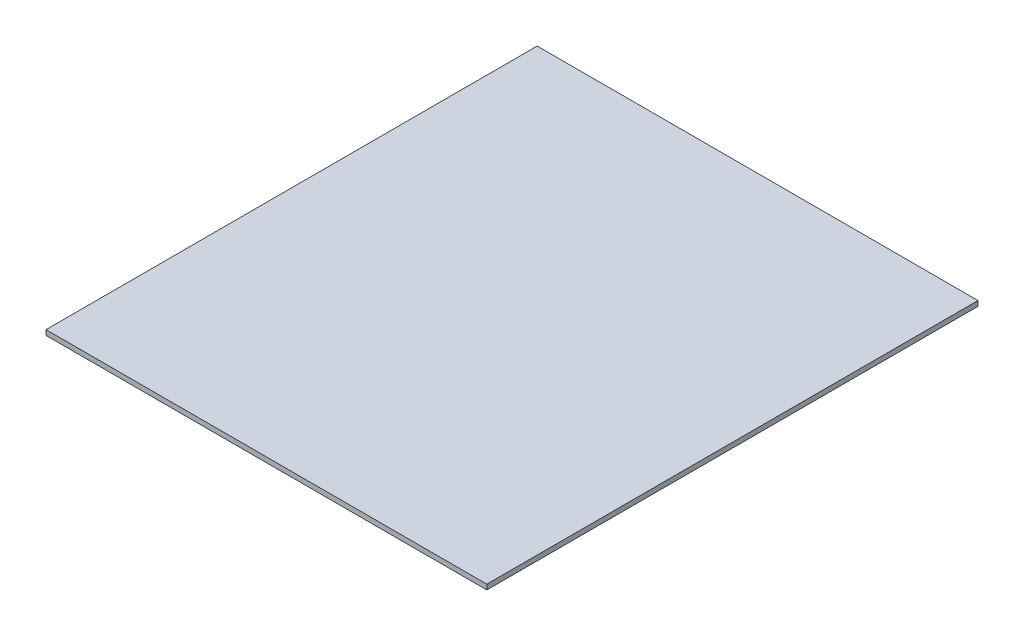
ISO-10303-21;
HEADER;
FILE_DESCRIPTION(('STEP AP214'),'2;1');
FILE_NAME('part.step','',(''),(''),'','','');
FILE_SCHEMA(('AUTOMOTIVE_DESIGN { 1 0 10303 214 1 1 1 1 }'));
ENDSEC;
DATA;
#1=APPLICATION_CONTEXT('core data for automotive mechanical design processes');
#2=APPLICATION_PROTOCOL_DEFINITION('international standard','automotive_design',2000,#1);
#3=PRODUCT_CONTEXT('',#1,'mechanical');
#4=PRODUCT('Part','Part','',(#3));
#5=PRODUCT_RELATED_PRODUCT_CATEGORY('part','',(#4));
#6=PRODUCT_DEFINITION_FORMATION('','',#4);
#7=PRODUCT_DEFINITION_CONTEXT('part definition',#1,'design');
#8=PRODUCT_DEFINITION('design','',#6,#7);
#9=PRODUCT_DEFINITION_SHAPE('','',#8);
#10=(LENGTH_UNIT() NAMED_UNIT(*) SI_UNIT(.MILLI.,.METRE.));
#11=(NAMED_UNIT(*) PLANE_ANGLE_UNIT() SI_UNIT($,.RADIAN.));
#12=(NAMED_UNIT(*) SI_UNIT($,.STERADIAN.) SOLID_ANGLE_UNIT());
#13=UNCERTAINTY_MEASURE_WITH_UNIT(LENGTH_MEASURE(1.E-05),#10,'distance_accuracy_value','');
#14=(GEOMETRIC_REPRESENTATION_CONTEXT(3) GLOBAL_UNCERTAINTY_ASSIGNED_CONTEXT((#13)) GLOBAL_UNIT_ASSIGNED_CONTEXT((#10,
#11,#12)) REPRESENTATION_CONTEXT('',''));
#15=CARTESIAN_POINT('',(0.,0.,0.));
#16=DIRECTION('',(0.,0.,1.));
#17=DIRECTION('',(1.,0.,0.));
#18=AXIS2_PLACEMENT_3D('',#15,#16,#17);
#19=CARTESIAN_POINT('',(175.,2.,-195.));
#20=DIRECTION('',(-1.,0.,0.));
#21=DIRECTION('',(0.,0.,1.));
#22=AXIS2_PLACEMENT_3D('',#19,#20,#21);
#23=PLANE('',#22);
#24=DIRECTION('',(0.,0.,-1.));
#25=VECTOR('',#24,1.);
#26=CARTESIAN_POINT('',(175.,-2.,-195.));
#27=LINE('',#26,#25);
#28=CARTESIAN_POINT('',(175.,-2.,195.));
#29=VERTEX_POINT('',#28);
#30=CARTESIAN_POINT('',(175.,-2.,-195.));
#31=VERTEX_POINT('',#30);
#32=EDGE_CURVE('E99',#29,#31,#27,.T.);
#33=ORIENTED_EDGE('',*,*,#32,.T.);
#34=DIRECTION('',(0.,-1.,0.));
#35=VECTOR('',#34,1.);
#36=CARTESIAN_POINT('',(175.,2.,-195.));
#37=LINE('',#36,#35);
#38=CARTESIAN_POINT('',(175.,2.,-195.));
#39=VERTEX_POINT('',#38);
#40=EDGE_CURVE('E11',#39,#31,#37,.T.);
#41=ORIENTED_EDGE('',*,*,#40,.F.);
#42=DIRECTION('',(0.,0.,-1.));
#43=VECTOR('',#42,1.);
#44=CARTESIAN_POINT('',(175.,2.,-195.));
#45=LINE('',#44,#43);
#46=CARTESIAN_POINT('',(175.,2.,195.));
#47=VERTEX_POINT('',#46);
#48=EDGE_CURVE('E87',#47,#39,#45,.T.);
#49=ORIENTED_EDGE('',*,*,#48,.F.);
#50=DIRECTION('',(0.,-1.,0.));
#51=VECTOR('',#50,1.);
#52=CARTESIAN_POINT('',(175.,2.,195.));
#53=LINE('',#52,#51);
#54=EDGE_CURVE('E95',#47,#29,#53,.T.);
#55=ORIENTED_EDGE('',*,*,#54,.T.);
#56=EDGE_LOOP('',(#33,#41,#49,#55));
#57=FACE_BOUND('',#56,.T.);
#58=ADVANCED_FACE('F36',(#57),#23,.F.);
#59=CARTESIAN_POINT('',(-175.,2.,-195.));
#60=DIRECTION('',(0.,0.,1.));
#61=DIRECTION('',(1.,0.,0.));
#62=AXIS2_PLACEMENT_3D('',#59,#60,#61);
#63=PLANE('',#62);
#64=DIRECTION('',(-1.,0.,0.));
#65=VECTOR('',#64,1.);
#66=CARTESIAN_POINT('',(-175.,-2.,-195.));
#67=LINE('',#66,#65);
#68=CARTESIAN_POINT('',(-175.,-2.,-195.));
#69=VERTEX_POINT('',#68);
#70=EDGE_CURVE('E91',#31,#69,#67,.T.);
#71=ORIENTED_EDGE('',*,*,#70,.T.);
#72=DIRECTION('',(0.,-1.,0.));
#73=VECTOR('',#72,1.);
#74=CARTESIAN_POINT('',(-175.,2.,-195.));
#75=LINE('',#74,#73);
#76=CARTESIAN_POINT('',(-175.,2.,-195.));
#77=VERTEX_POINT('',#76);
#78=EDGE_CURVE('E44',#77,#69,#75,.T.);
#79=ORIENTED_EDGE('',*,*,#78,.F.);
#80=DIRECTION('',(-1.,0.,0.));
#81=VECTOR('',#80,1.);
#82=CARTESIAN_POINT('',(-175.,2.,-195.));
#83=LINE('',#82,#81);
#84=EDGE_CURVE('E82',#39,#77,#83,.T.);
#85=ORIENTED_EDGE('',*,*,#84,.F.);
#86=ORIENTED_EDGE('',*,*,#40,.T.);
#87=EDGE_LOOP('',(#71,#79,#85,#86));
#88=FACE_BOUND('',#87,.T.);
#89=ADVANCED_FACE('F90',(#88),#63,.F.);
#90=CARTESIAN_POINT('',(-175.,2.,-195.));
#91=DIRECTION('',(1.,0.,0.));
#92=DIRECTION('',(0.,0.,-1.));
#93=AXIS2_PLACEMENT_3D('',#90,#91,#92);
#94=PLANE('',#93);
#95=DIRECTION('',(0.,0.,1.));
#96=VECTOR('',#95,1.);
#97=CARTESIAN_POINT('',(-175.,-2.,-195.));
#98=LINE('',#97,#96);
#99=CARTESIAN_POINT('',(-175.,-2.,195.));
#100=VERTEX_POINT('',#99);
#101=EDGE_CURVE('E69',#69,#100,#98,.T.);
#102=ORIENTED_EDGE('',*,*,#101,.T.);
#103=DIRECTION('',(0.,-1.,0.));
#104=VECTOR('',#103,1.);
#105=CARTESIAN_POINT('',(-175.,2.,195.));
#106=LINE('',#105,#104);
#107=CARTESIAN_POINT('',(-175.,2.,195.));
#108=VERTEX_POINT('',#107);
#109=EDGE_CURVE('E92',#108,#100,#106,.T.);
#110=ORIENTED_EDGE('',*,*,#109,.F.);
#111=DIRECTION('',(0.,0.,1.));
#112=VECTOR('',#111,1.);
#113=CARTESIAN_POINT('',(-175.,2.,-195.));
#114=LINE('',#113,#112);
#115=EDGE_CURVE('E85',#77,#108,#114,.T.);
#116=ORIENTED_EDGE('',*,*,#115,.F.);
#117=ORIENTED_EDGE('',*,*,#78,.T.);
#118=EDGE_LOOP('',(#102,#110,#116,#117));
#119=FACE_BOUND('',#118,.T.);
#120=ADVANCED_FACE('F93',(#119),#94,.F.);
#121=CARTESIAN_POINT('',(-175.,2.,195.));
#122=DIRECTION('',(0.,0.,-1.));
#123=DIRECTION('',(-1.,0.,0.));
#124=AXIS2_PLACEMENT_3D('',#121,#122,#123);
#125=PLANE('',#124);
#126=DIRECTION('',(1.,0.,0.));
#127=VECTOR('',#126,1.);
#128=CARTESIAN_POINT('',(-175.,-2.,195.));
#129=LINE('',#128,#127);
#130=EDGE_CURVE('E75',#100,#29,#129,.T.);
#131=ORIENTED_EDGE('',*,*,#130,.T.);
#132=ORIENTED_EDGE('',*,*,#54,.F.);
#133=DIRECTION('',(1.,0.,0.));
#134=VECTOR('',#133,1.);
#135=CARTESIAN_POINT('',(-175.,2.,195.));
#136=LINE('',#135,#134);
#137=EDGE_CURVE('E52',#108,#47,#136,.T.);
#138=ORIENTED_EDGE('',*,*,#137,.F.);
#139=ORIENTED_EDGE('',*,*,#109,.T.);
#140=EDGE_LOOP('',(#131,#132,#138,#139));
#141=FACE_BOUND('',#140,.T.);
#142=ADVANCED_FACE('F106',(#141),#125,.F.);
#143=CARTESIAN_POINT('',(0.,2.,0.));
#144=DIRECTION('',(0.,1.,0.));
#145=DIRECTION('',(0.,0.,1.));
#146=AXIS2_PLACEMENT_3D('',#143,#144,#145);
#147=PLANE('',#146);
#148=ORIENTED_EDGE('',*,*,#48,.T.);
#149=ORIENTED_EDGE('',*,*,#84,.T.);
#150=ORIENTED_EDGE('',*,*,#115,.T.);
#151=ORIENTED_EDGE('',*,*,#137,.T.);
#152=EDGE_LOOP('',(#148,#149,#150,#151));
#153=FACE_BOUND('',#152,.T.);
#154=ADVANCED_FACE('F83',(#153),#147,.T.);
#155=CARTESIAN_POINT('',(0.,-2.,0.));
#156=DIRECTION('',(0.,1.,0.));
#157=DIRECTION('',(0.,0.,1.));
#158=AXIS2_PLACEMENT_3D('',#155,#156,#157);
#159=PLANE('',#158);
#160=ORIENTED_EDGE('',*,*,#32,.F.);
#161=ORIENTED_EDGE('',*,*,#130,.F.);
#162=ORIENTED_EDGE('',*,*,#101,.F.);
#163=ORIENTED_EDGE('',*,*,#70,.F.);
#164=EDGE_LOOP('',(#160,#161,#162,#163));
#165=FACE_BOUND('',#164,.T.);
#166=ADVANCED_FACE('F109',(#165),#159,.F.);
#167=CLOSED_SHELL('',(#58,#89,#120,#142,#154,#166));
#168=MANIFOLD_SOLID_BREP('B2',#167);
#169=ADVANCED_BREP_SHAPE_REPRESENTATION('',(#18,#168),#14);
#170=SHAPE_DEFINITION_REPRESENTATION(#9,#169);
ENDSEC;
END-ISO-10303-21;
